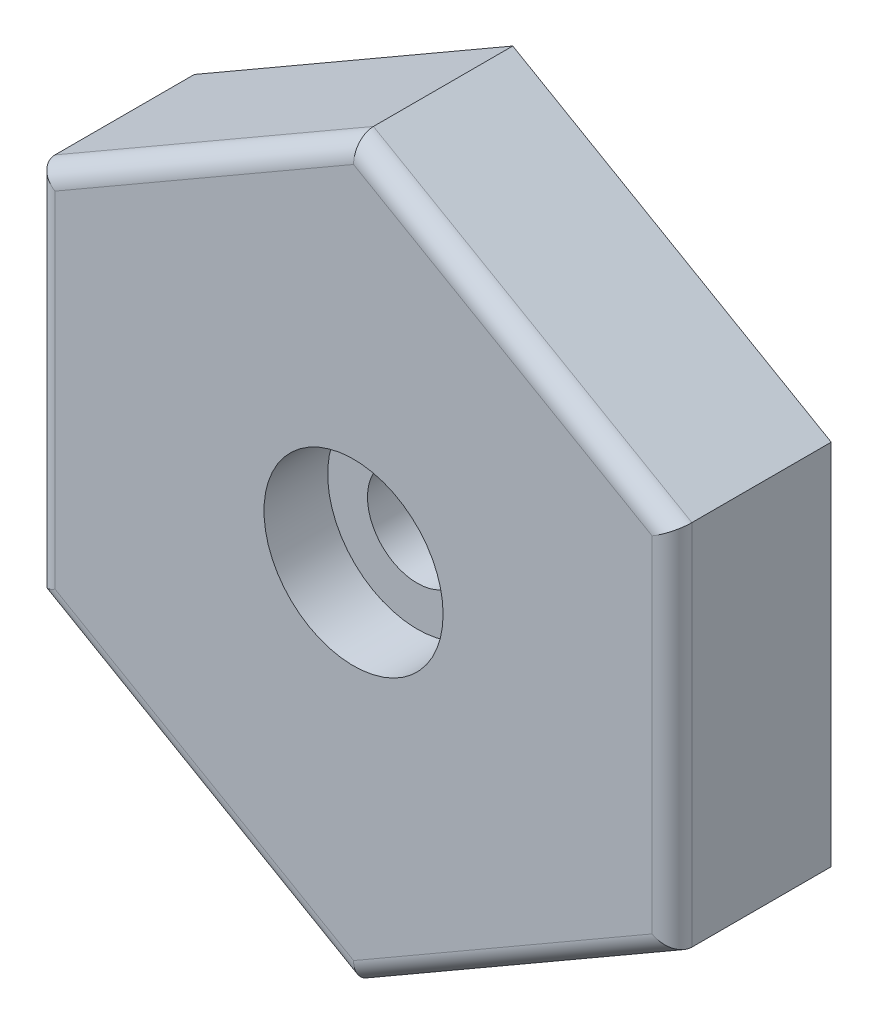
ISO-10303-21;
HEADER;
FILE_DESCRIPTION(('STEP AP214'),'2;1');
FILE_NAME('part.step','',(''),(''),'','','');
FILE_SCHEMA(('AUTOMOTIVE_DESIGN { 1 0 10303 214 1 1 1 1 }'));
ENDSEC;
DATA;
#1=APPLICATION_CONTEXT('core data for automotive mechanical design processes');
#2=APPLICATION_PROTOCOL_DEFINITION('international standard','automotive_design',2000,#1);
#3=PRODUCT_CONTEXT('',#1,'mechanical');
#4=PRODUCT('Part','Part','',(#3));
#5=PRODUCT_RELATED_PRODUCT_CATEGORY('part','',(#4));
#6=PRODUCT_DEFINITION_FORMATION('','',#4);
#7=PRODUCT_DEFINITION_CONTEXT('part definition',#1,'design');
#8=PRODUCT_DEFINITION('design','',#6,#7);
#9=PRODUCT_DEFINITION_SHAPE('','',#8);
#10=(LENGTH_UNIT() NAMED_UNIT(*) SI_UNIT(.MILLI.,.METRE.));
#11=(NAMED_UNIT(*) PLANE_ANGLE_UNIT() SI_UNIT($,.RADIAN.));
#12=(NAMED_UNIT(*) SI_UNIT($,.STERADIAN.) SOLID_ANGLE_UNIT());
#13=UNCERTAINTY_MEASURE_WITH_UNIT(LENGTH_MEASURE(1.E-05),#10,'distance_accuracy_value','');
#14=(GEOMETRIC_REPRESENTATION_CONTEXT(3) GLOBAL_UNCERTAINTY_ASSIGNED_CONTEXT((#13)) GLOBAL_UNIT_ASSIGNED_CONTEXT((#10,
#11,#12)) REPRESENTATION_CONTEXT('',''));
#15=CARTESIAN_POINT('',(0.,0.,0.));
#16=DIRECTION('',(0.,0.,1.));
#17=DIRECTION('',(1.,0.,0.));
#18=AXIS2_PLACEMENT_3D('',#15,#16,#17);
#19=CARTESIAN_POINT('',(0.,0.,8.));
#20=DIRECTION('',(0.,0.,-1.));
#21=DIRECTION('',(-1.,0.,0.));
#22=AXIS2_PLACEMENT_3D('',#19,#20,#21);
#23=CYLINDRICAL_SURFACE('',#22,2.5);
#24=CARTESIAN_POINT('',(0.,0.,4.8));
#25=DIRECTION('',(0.,0.,1.));
#26=DIRECTION('',(1.,0.,0.));
#27=AXIS2_PLACEMENT_3D('',#24,#25,#26);
#28=CIRCLE('',#27,2.5);
#29=CARTESIAN_POINT('',(2.5,0.,4.8));
#30=VERTEX_POINT('',#29);
#31=EDGE_CURVE('E231',#30,#30,#28,.T.);
#32=ORIENTED_EDGE('',*,*,#31,.T.);
#33=EDGE_LOOP('',(#32));
#34=FACE_BOUND('',#33,.T.);
#35=CARTESIAN_POINT('',(0.,0.,2.));
#36=DIRECTION('',(0.,0.,-1.));
#37=DIRECTION('',(-1.,0.,0.));
#38=AXIS2_PLACEMENT_3D('',#35,#36,#37);
#39=CIRCLE('',#38,2.5);
#40=CARTESIAN_POINT('',(-2.5,0.,2.));
#41=VERTEX_POINT('',#40);
#42=EDGE_CURVE('E318',#41,#41,#39,.T.);
#43=ORIENTED_EDGE('',*,*,#42,.T.);
#44=EDGE_LOOP('',(#43));
#45=FACE_BOUND('',#44,.T.);
#46=ADVANCED_FACE('F39',(#34,#45),#23,.F.);
#47=CARTESIAN_POINT('',(0.,0.,6.));
#48=DIRECTION('',(0.,0.,-1.));
#49=DIRECTION('',(-1.,0.,0.));
#50=AXIS2_PLACEMENT_3D('',#47,#48,#49);
#51=CYLINDRICAL_SURFACE('',#50,8.);
#52=CARTESIAN_POINT('',(0.,0.,6.));
#53=DIRECTION('',(0.,0.,-1.));
#54=DIRECTION('',(-1.,0.,0.));
#55=AXIS2_PLACEMENT_3D('',#52,#53,#54);
#56=CIRCLE('',#55,8.);
#57=CARTESIAN_POINT('',(-8.,0.,6.));
#58=VERTEX_POINT('',#57);
#59=EDGE_CURVE('E182',#58,#58,#56,.T.);
#60=ORIENTED_EDGE('',*,*,#59,.T.);
#61=EDGE_LOOP('',(#60));
#62=FACE_BOUND('',#61,.T.);
#63=CARTESIAN_POINT('',(0.,0.,2.));
#64=DIRECTION('',(0.,0.,-1.));
#65=DIRECTION('',(-1.,0.,0.));
#66=AXIS2_PLACEMENT_3D('',#63,#64,#65);
#67=CIRCLE('',#66,8.);
#68=CARTESIAN_POINT('',(-8.,0.,2.));
#69=VERTEX_POINT('',#68);
#70=EDGE_CURVE('E630',#69,#69,#67,.T.);
#71=ORIENTED_EDGE('',*,*,#70,.F.);
#72=EDGE_LOOP('',(#71));
#73=FACE_BOUND('',#72,.T.);
#74=ADVANCED_FACE('F344',(#62,#73),#51,.T.);
#75=CARTESIAN_POINT('',(0.,0.,8.));
#76=DIRECTION('',(0.,0.,1.));
#77=DIRECTION('',(1.,0.,0.));
#78=AXIS2_PLACEMENT_3D('',#75,#76,#77);
#79=PLANE('',#78);
#80=DIRECTION('',(-0.866025403784439,0.5,0.));
#81=VECTOR('',#80,1.);
#82=CARTESIAN_POINT('',(-0.500000000000005,17.6091832102836,8.));
#83=LINE('',#82,#81);
#84=CARTESIAN_POINT('',(15.,8.66025403784437,8.));
#85=VERTEX_POINT('',#84);
#86=CARTESIAN_POINT('',(0.,17.3205080756887,8.));
#87=VERTEX_POINT('',#86);
#88=EDGE_CURVE('E277',#85,#87,#83,.T.);
#89=ORIENTED_EDGE('',*,*,#88,.T.);
#90=DIRECTION('',(-0.866025403784439,-0.5,0.));
#91=VECTOR('',#90,1.);
#92=CARTESIAN_POINT('',(-15.5,8.37157890324957,8.));
#93=LINE('',#92,#91);
#94=CARTESIAN_POINT('',(-15.,8.66025403784438,8.));
#95=VERTEX_POINT('',#94);
#96=EDGE_CURVE('E295',#87,#95,#93,.T.);
#97=ORIENTED_EDGE('',*,*,#96,.T.);
#98=DIRECTION('',(0.,-1.,0.));
#99=VECTOR('',#98,1.);
#100=CARTESIAN_POINT('',(-15.,-9.23760430703399,8.));
#101=LINE('',#100,#99);
#102=CARTESIAN_POINT('',(-15.,-8.66025403784436,8.));
#103=VERTEX_POINT('',#102);
#104=EDGE_CURVE('E292',#95,#103,#101,.T.);
#105=ORIENTED_EDGE('',*,*,#104,.T.);
#106=DIRECTION('',(0.866025403784439,-0.5,0.));
#107=VECTOR('',#106,1.);
#108=CARTESIAN_POINT('',(0.500000000000035,-17.6091832102836,8.));
#109=LINE('',#108,#107);
#110=CARTESIAN_POINT('',(0.,-17.3205080756887,8.));
#111=VERTEX_POINT('',#110);
#112=EDGE_CURVE('E289',#103,#111,#109,.T.);
#113=ORIENTED_EDGE('',*,*,#112,.T.);
#114=DIRECTION('',(0.866025403784439,0.5,0.));
#115=VECTOR('',#114,1.);
#116=CARTESIAN_POINT('',(15.5,-8.37157890324957,8.));
#117=LINE('',#116,#115);
#118=CARTESIAN_POINT('',(15.,-8.66025403784439,8.));
#119=VERTEX_POINT('',#118);
#120=EDGE_CURVE('E286',#111,#119,#117,.T.);
#121=ORIENTED_EDGE('',*,*,#120,.T.);
#122=DIRECTION('',(0.,1.,0.));
#123=VECTOR('',#122,1.);
#124=CARTESIAN_POINT('',(15.,9.23760430703399,8.));
#125=LINE('',#124,#123);
#126=EDGE_CURVE('E283',#119,#85,#125,.T.);
#127=ORIENTED_EDGE('',*,*,#126,.T.);
#128=EDGE_LOOP('',(#89,#97,#105,#113,#121,#127));
#129=FACE_BOUND('',#128,.T.);
#130=CARTESIAN_POINT('',(0.,0.,8.));
#131=DIRECTION('',(0.,0.,1.));
#132=DIRECTION('',(1.,0.,0.));
#133=AXIS2_PLACEMENT_3D('',#130,#131,#132);
#134=CIRCLE('',#133,4.5);
#135=CARTESIAN_POINT('',(4.5,0.,8.));
#136=VERTEX_POINT('',#135);
#137=EDGE_CURVE('E215',#136,#136,#134,.T.);
#138=ORIENTED_EDGE('',*,*,#137,.F.);
#139=EDGE_LOOP('',(#138));
#140=FACE_BOUND('',#139,.T.);
#141=ADVANCED_FACE('F365',(#129,#140),#79,.T.);
#142=CARTESIAN_POINT('',(0.,0.,0.));
#143=DIRECTION('',(0.,0.,1.));
#144=DIRECTION('',(1.,0.,0.));
#145=AXIS2_PLACEMENT_3D('',#142,#143,#144);
#146=PLANE('',#145);
#147=DIRECTION('',(0.5,0.866025403784439,0.));
#148=VECTOR('',#147,1.);
#149=CARTESIAN_POINT('',(-13.971876514389,0.,0.));
#150=LINE('',#149,#148);
#151=CARTESIAN_POINT('',(-13.971876514389,0.,0.));
#152=VERTEX_POINT('',#151);
#153=CARTESIAN_POINT('',(-6.98593825719448,12.1,0.));
#154=VERTEX_POINT('',#153);
#155=EDGE_CURVE('E198',#152,#154,#150,.T.);
#156=ORIENTED_EDGE('',*,*,#155,.F.);
#157=DIRECTION('',(-0.5,0.866025403784439,0.));
#158=VECTOR('',#157,1.);
#159=CARTESIAN_POINT('',(-6.98593825719447,-12.1,0.));
#160=LINE('',#159,#158);
#161=CARTESIAN_POINT('',(-6.98593825719447,-12.1,0.));
#162=VERTEX_POINT('',#161);
#163=EDGE_CURVE('E154',#162,#152,#160,.T.);
#164=ORIENTED_EDGE('',*,*,#163,.F.);
#165=DIRECTION('',(-1.,0.,0.));
#166=VECTOR('',#165,1.);
#167=CARTESIAN_POINT('',(6.98593825719447,-12.1,0.));
#168=LINE('',#167,#166);
#169=CARTESIAN_POINT('',(6.98593825719447,-12.1,0.));
#170=VERTEX_POINT('',#169);
#171=EDGE_CURVE('E175',#170,#162,#168,.T.);
#172=ORIENTED_EDGE('',*,*,#171,.F.);
#173=DIRECTION('',(-0.5,-0.866025403784439,0.));
#174=VECTOR('',#173,1.);
#175=CARTESIAN_POINT('',(13.971876514389,0.,0.));
#176=LINE('',#175,#174);
#177=CARTESIAN_POINT('',(13.971876514389,0.,0.));
#178=VERTEX_POINT('',#177);
#179=EDGE_CURVE('E179',#178,#170,#176,.T.);
#180=ORIENTED_EDGE('',*,*,#179,.F.);
#181=DIRECTION('',(0.5,-0.866025403784439,0.));
#182=VECTOR('',#181,1.);
#183=CARTESIAN_POINT('',(6.98593825719448,12.1,0.));
#184=LINE('',#183,#182);
#185=CARTESIAN_POINT('',(6.98593825719448,12.1,0.));
#186=VERTEX_POINT('',#185);
#187=EDGE_CURVE('E205',#186,#178,#184,.T.);
#188=ORIENTED_EDGE('',*,*,#187,.F.);
#189=DIRECTION('',(1.,0.,0.));
#190=VECTOR('',#189,1.);
#191=CARTESIAN_POINT('',(-6.98593825719448,12.1,0.));
#192=LINE('',#191,#190);
#193=EDGE_CURVE('E201',#154,#186,#192,.T.);
#194=ORIENTED_EDGE('',*,*,#193,.F.);
#195=EDGE_LOOP('',(#156,#164,#172,#180,#188,#194));
#196=FACE_BOUND('',#195,.T.);
#197=DIRECTION('',(0.,1.,0.));
#198=VECTOR('',#197,1.);
#199=CARTESIAN_POINT('',(16.,-9.23760430703401,0.));
#200=LINE('',#199,#198);
#201=CARTESIAN_POINT('',(16.,-9.23760430703401,0.));
#202=VERTEX_POINT('',#201);
#203=CARTESIAN_POINT('',(16.,9.23760430703399,0.));
#204=VERTEX_POINT('',#203);
#205=EDGE_CURVE('E235',#202,#204,#200,.T.);
#206=ORIENTED_EDGE('',*,*,#205,.F.);
#207=DIRECTION('',(0.866025403784439,0.5,0.));
#208=VECTOR('',#207,1.);
#209=CARTESIAN_POINT('',(0.,-18.475208614068,0.));
#210=LINE('',#209,#208);
#211=CARTESIAN_POINT('',(0.,-18.475208614068,0.));
#212=VERTEX_POINT('',#211);
#213=EDGE_CURVE('E255',#212,#202,#210,.T.);
#214=ORIENTED_EDGE('',*,*,#213,.F.);
#215=DIRECTION('',(0.866025403784439,-0.5,0.));
#216=VECTOR('',#215,1.);
#217=CARTESIAN_POINT('',(-16.,-9.23760430703399,0.));
#218=LINE('',#217,#216);
#219=CARTESIAN_POINT('',(-16.,-9.23760430703399,0.));
#220=VERTEX_POINT('',#219);
#221=EDGE_CURVE('E251',#220,#212,#218,.T.);
#222=ORIENTED_EDGE('',*,*,#221,.F.);
#223=DIRECTION('',(0.,-1.,0.));
#224=VECTOR('',#223,1.);
#225=CARTESIAN_POINT('',(-16.,9.23760430703401,0.));
#226=LINE('',#225,#224);
#227=CARTESIAN_POINT('',(-16.,9.23760430703401,0.));
#228=VERTEX_POINT('',#227);
#229=EDGE_CURVE('E247',#228,#220,#226,.T.);
#230=ORIENTED_EDGE('',*,*,#229,.F.);
#231=DIRECTION('',(-0.866025403784439,-0.5,0.));
#232=VECTOR('',#231,1.);
#233=CARTESIAN_POINT('',(0.,18.475208614068,0.));
#234=LINE('',#233,#232);
#235=CARTESIAN_POINT('',(0.,18.475208614068,0.));
#236=VERTEX_POINT('',#235);
#237=EDGE_CURVE('E243',#236,#228,#234,.T.);
#238=ORIENTED_EDGE('',*,*,#237,.F.);
#239=DIRECTION('',(-0.866025403784438,0.5,0.));
#240=VECTOR('',#239,1.);
#241=CARTESIAN_POINT('',(16.,9.23760430703399,0.));
#242=LINE('',#241,#240);
#243=EDGE_CURVE('E239',#204,#236,#242,.T.);
#244=ORIENTED_EDGE('',*,*,#243,.F.);
#245=EDGE_LOOP('',(#206,#214,#222,#230,#238,#244));
#246=FACE_BOUND('',#245,.T.);
#247=ADVANCED_FACE('F373',(#196,#246),#146,.F.);
#248=CARTESIAN_POINT('',(16.,-9.23760430703401,8.));
#249=DIRECTION('',(-1.,0.,0.));
#250=DIRECTION('',(0.,-1.,0.));
#251=AXIS2_PLACEMENT_3D('',#248,#249,#250);
#252=PLANE('',#251);
#253=DIRECTION('',(0.,0.,-1.));
#254=VECTOR('',#253,1.);
#255=CARTESIAN_POINT('',(16.,9.23760430703399,8.));
#256=LINE('',#255,#254);
#257=CARTESIAN_POINT('',(16.,9.23760430703399,7.));
#258=VERTEX_POINT('',#257);
#259=EDGE_CURVE('E274',#258,#204,#256,.T.);
#260=ORIENTED_EDGE('',*,*,#259,.F.);
#261=DIRECTION('',(0.,1.,0.));
#262=VECTOR('',#261,1.);
#263=CARTESIAN_POINT('',(16.,-9.23760430703401,7.));
#264=LINE('',#263,#262);
#265=CARTESIAN_POINT('',(16.,-9.23760430703401,7.));
#266=VERTEX_POINT('',#265);
#267=EDGE_CURVE('E49',#258,#266,#264,.F.);
#268=ORIENTED_EDGE('',*,*,#267,.T.);
#269=DIRECTION('',(0.,0.,-1.));
#270=VECTOR('',#269,1.);
#271=CARTESIAN_POINT('',(16.,-9.23760430703401,8.));
#272=LINE('',#271,#270);
#273=EDGE_CURVE('E259',#266,#202,#272,.T.);
#274=ORIENTED_EDGE('',*,*,#273,.T.);
#275=ORIENTED_EDGE('',*,*,#205,.T.);
#276=EDGE_LOOP('',(#260,#268,#274,#275));
#277=FACE_BOUND('',#276,.T.);
#278=ADVANCED_FACE('F377',(#277),#252,.F.);
#279=CARTESIAN_POINT('',(16.,9.23760430703399,8.));
#280=DIRECTION('',(-0.5,-0.866025403784438,0.));
#281=DIRECTION('',(0.866025403784439,-0.5,0.));
#282=AXIS2_PLACEMENT_3D('',#279,#280,#281);
#283=PLANE('',#282);
#284=DIRECTION('',(0.,0.,-1.));
#285=VECTOR('',#284,1.);
#286=CARTESIAN_POINT('',(0.,18.475208614068,8.));
#287=LINE('',#286,#285);
#288=CARTESIAN_POINT('',(0.,18.475208614068,7.));
#289=VERTEX_POINT('',#288);
#290=EDGE_CURVE('E271',#289,#236,#287,.T.);
#291=ORIENTED_EDGE('',*,*,#290,.F.);
#292=DIRECTION('',(-0.866025403784439,0.5,0.));
#293=VECTOR('',#292,1.);
#294=CARTESIAN_POINT('',(16.,9.23760430703399,7.));
#295=LINE('',#294,#293);
#296=EDGE_CURVE('E11',#289,#258,#295,.F.);
#297=ORIENTED_EDGE('',*,*,#296,.T.);
#298=ORIENTED_EDGE('',*,*,#259,.T.);
#299=ORIENTED_EDGE('',*,*,#243,.T.);
#300=EDGE_LOOP('',(#291,#297,#298,#299));
#301=FACE_BOUND('',#300,.T.);
#302=ADVANCED_FACE('F394',(#301),#283,.F.);
#303=CARTESIAN_POINT('',(0.,18.475208614068,8.));
#304=DIRECTION('',(0.5,-0.866025403784439,0.));
#305=DIRECTION('',(0.866025403784439,0.5,0.));
#306=AXIS2_PLACEMENT_3D('',#303,#304,#305);
#307=PLANE('',#306);
#308=DIRECTION('',(0.,0.,-1.));
#309=VECTOR('',#308,1.);
#310=CARTESIAN_POINT('',(-16.,9.23760430703401,8.));
#311=LINE('',#310,#309);
#312=CARTESIAN_POINT('',(-16.,9.23760430703401,7.));
#313=VERTEX_POINT('',#312);
#314=EDGE_CURVE('E268',#313,#228,#311,.T.);
#315=ORIENTED_EDGE('',*,*,#314,.F.);
#316=DIRECTION('',(-0.866025403784439,-0.5,0.));
#317=VECTOR('',#316,1.);
#318=CARTESIAN_POINT('',(0.,18.475208614068,7.));
#319=LINE('',#318,#317);
#320=EDGE_CURVE('E299',#313,#289,#319,.F.);
#321=ORIENTED_EDGE('',*,*,#320,.T.);
#322=ORIENTED_EDGE('',*,*,#290,.T.);
#323=ORIENTED_EDGE('',*,*,#237,.T.);
#324=EDGE_LOOP('',(#315,#321,#322,#323));
#325=FACE_BOUND('',#324,.T.);
#326=ADVANCED_FACE('F390',(#325),#307,.F.);
#327=CARTESIAN_POINT('',(-16.,9.23760430703401,8.));
#328=DIRECTION('',(1.,0.,0.));
#329=DIRECTION('',(0.,1.,0.));
#330=AXIS2_PLACEMENT_3D('',#327,#328,#329);
#331=PLANE('',#330);
#332=DIRECTION('',(0.,0.,-1.));
#333=VECTOR('',#332,1.);
#334=CARTESIAN_POINT('',(-16.,-9.23760430703399,8.));
#335=LINE('',#334,#333);
#336=CARTESIAN_POINT('',(-16.,-9.23760430703399,7.));
#337=VERTEX_POINT('',#336);
#338=EDGE_CURVE('E265',#337,#220,#335,.T.);
#339=ORIENTED_EDGE('',*,*,#338,.F.);
#340=DIRECTION('',(0.,-1.,0.));
#341=VECTOR('',#340,1.);
#342=CARTESIAN_POINT('',(-16.,9.23760430703401,7.));
#343=LINE('',#342,#341);
#344=EDGE_CURVE('E303',#337,#313,#343,.F.);
#345=ORIENTED_EDGE('',*,*,#344,.T.);
#346=ORIENTED_EDGE('',*,*,#314,.T.);
#347=ORIENTED_EDGE('',*,*,#229,.T.);
#348=EDGE_LOOP('',(#339,#345,#346,#347));
#349=FACE_BOUND('',#348,.T.);
#350=ADVANCED_FACE('F386',(#349),#331,.F.);
#351=CARTESIAN_POINT('',(-16.,-9.23760430703399,8.));
#352=DIRECTION('',(0.5,0.866025403784439,0.));
#353=DIRECTION('',(-0.866025403784439,0.5,0.));
#354=AXIS2_PLACEMENT_3D('',#351,#352,#353);
#355=PLANE('',#354);
#356=DIRECTION('',(0.,0.,-1.));
#357=VECTOR('',#356,1.);
#358=CARTESIAN_POINT('',(0.,-18.475208614068,8.));
#359=LINE('',#358,#357);
#360=CARTESIAN_POINT('',(0.,-18.475208614068,7.));
#361=VERTEX_POINT('',#360);
#362=EDGE_CURVE('E262',#361,#212,#359,.T.);
#363=ORIENTED_EDGE('',*,*,#362,.F.);
#364=DIRECTION('',(0.866025403784439,-0.5,0.));
#365=VECTOR('',#364,1.);
#366=CARTESIAN_POINT('',(-16.,-9.23760430703399,7.));
#367=LINE('',#366,#365);
#368=EDGE_CURVE('E306',#361,#337,#367,.F.);
#369=ORIENTED_EDGE('',*,*,#368,.T.);
#370=ORIENTED_EDGE('',*,*,#338,.T.);
#371=ORIENTED_EDGE('',*,*,#221,.T.);
#372=EDGE_LOOP('',(#363,#369,#370,#371));
#373=FACE_BOUND('',#372,.T.);
#374=ADVANCED_FACE('F382',(#373),#355,.F.);
#375=CARTESIAN_POINT('',(0.,-18.475208614068,8.));
#376=DIRECTION('',(-0.5,0.866025403784439,0.));
#377=DIRECTION('',(-0.866025403784439,-0.5,0.));
#378=AXIS2_PLACEMENT_3D('',#375,#376,#377);
#379=PLANE('',#378);
#380=ORIENTED_EDGE('',*,*,#273,.F.);
#381=DIRECTION('',(0.866025403784439,0.5,0.));
#382=VECTOR('',#381,1.);
#383=CARTESIAN_POINT('',(0.,-18.475208614068,7.));
#384=LINE('',#383,#382);
#385=EDGE_CURVE('E309',#266,#361,#384,.F.);
#386=ORIENTED_EDGE('',*,*,#385,.T.);
#387=ORIENTED_EDGE('',*,*,#362,.T.);
#388=ORIENTED_EDGE('',*,*,#213,.T.);
#389=EDGE_LOOP('',(#380,#386,#387,#388));
#390=FACE_BOUND('',#389,.T.);
#391=ADVANCED_FACE('F379',(#390),#379,.F.);
#392=CARTESIAN_POINT('',(0.,0.,4.8));
#393=DIRECTION('',(0.,0.,1.));
#394=DIRECTION('',(1.,0.,0.));
#395=AXIS2_PLACEMENT_3D('',#392,#393,#394);
#396=CYLINDRICAL_SURFACE('',#395,4.5);
#397=CARTESIAN_POINT('',(0.,0.,4.8));
#398=DIRECTION('',(0.,0.,1.));
#399=DIRECTION('',(1.,0.,0.));
#400=AXIS2_PLACEMENT_3D('',#397,#398,#399);
#401=CIRCLE('',#400,4.5);
#402=CARTESIAN_POINT('',(4.5,0.,4.8));
#403=VERTEX_POINT('',#402);
#404=EDGE_CURVE('E227',#403,#403,#401,.T.);
#405=ORIENTED_EDGE('',*,*,#404,.F.);
#406=EDGE_LOOP('',(#405));
#407=FACE_BOUND('',#406,.T.);
#408=ORIENTED_EDGE('',*,*,#137,.T.);
#409=EDGE_LOOP('',(#408));
#410=FACE_BOUND('',#409,.T.);
#411=ADVANCED_FACE('F369',(#407,#410),#396,.F.);
#412=CARTESIAN_POINT('',(0.,0.,4.8));
#413=DIRECTION('',(0.,0.,1.));
#414=DIRECTION('',(1.,0.,0.));
#415=AXIS2_PLACEMENT_3D('',#412,#413,#414);
#416=PLANE('',#415);
#417=ORIENTED_EDGE('',*,*,#31,.F.);
#418=EDGE_LOOP('',(#417));
#419=FACE_BOUND('',#418,.T.);
#420=ORIENTED_EDGE('',*,*,#404,.T.);
#421=EDGE_LOOP('',(#420));
#422=FACE_BOUND('',#421,.T.);
#423=ADVANCED_FACE('F495',(#419,#422),#416,.T.);
#424=CARTESIAN_POINT('',(-6.98593825719447,-12.1,6.));
#425=DIRECTION('',(-0.866025403784439,-0.5,0.));
#426=DIRECTION('',(0.5,-0.866025403784439,0.));
#427=AXIS2_PLACEMENT_3D('',#424,#425,#426);
#428=PLANE('',#427);
#429=ORIENTED_EDGE('',*,*,#163,.T.);
#430=DIRECTION('',(0.,0.,-1.));
#431=VECTOR('',#430,1.);
#432=CARTESIAN_POINT('',(-13.971876514389,0.,6.));
#433=LINE('',#432,#431);
#434=CARTESIAN_POINT('',(-13.971876514389,0.,6.));
#435=VERTEX_POINT('',#434);
#436=EDGE_CURVE('E147',#435,#152,#433,.T.);
#437=ORIENTED_EDGE('',*,*,#436,.F.);
#438=DIRECTION('',(-0.5,0.866025403784439,0.));
#439=VECTOR('',#438,1.);
#440=CARTESIAN_POINT('',(-6.98593825719447,-12.1,6.));
#441=LINE('',#440,#439);
#442=CARTESIAN_POINT('',(-6.98593825719447,-12.1,6.));
#443=VERTEX_POINT('',#442);
#444=EDGE_CURVE('E151',#443,#435,#441,.T.);
#445=ORIENTED_EDGE('',*,*,#444,.F.);
#446=DIRECTION('',(0.,0.,-1.));
#447=VECTOR('',#446,1.);
#448=CARTESIAN_POINT('',(-6.98593825719447,-12.1,6.));
#449=LINE('',#448,#447);
#450=EDGE_CURVE('E212',#443,#162,#449,.T.);
#451=ORIENTED_EDGE('',*,*,#450,.T.);
#452=EDGE_LOOP('',(#429,#437,#445,#451));
#453=FACE_BOUND('',#452,.T.);
#454=ADVANCED_FACE('F149',(#453),#428,.F.);
#455=CARTESIAN_POINT('',(6.98593825719447,-12.1,6.));
#456=DIRECTION('',(0.,-1.,0.));
#457=DIRECTION('',(0.,0.,-1.));
#458=AXIS2_PLACEMENT_3D('',#455,#456,#457);
#459=PLANE('',#458);
#460=ORIENTED_EDGE('',*,*,#171,.T.);
#461=ORIENTED_EDGE('',*,*,#450,.F.);
#462=DIRECTION('',(-1.,0.,0.));
#463=VECTOR('',#462,1.);
#464=CARTESIAN_POINT('',(6.98593825719447,-12.1,6.));
#465=LINE('',#464,#463);
#466=CARTESIAN_POINT('',(6.98593825719447,-12.1,6.));
#467=VERTEX_POINT('',#466);
#468=EDGE_CURVE('E160',#467,#443,#465,.T.);
#469=ORIENTED_EDGE('',*,*,#468,.F.);
#470=DIRECTION('',(0.,0.,-1.));
#471=VECTOR('',#470,1.);
#472=CARTESIAN_POINT('',(6.98593825719447,-12.1,6.));
#473=LINE('',#472,#471);
#474=EDGE_CURVE('E216',#467,#170,#473,.T.);
#475=ORIENTED_EDGE('',*,*,#474,.T.);
#476=EDGE_LOOP('',(#460,#461,#469,#475));
#477=FACE_BOUND('',#476,.T.);
#478=ADVANCED_FACE('F506',(#477),#459,.F.);
#479=CARTESIAN_POINT('',(13.971876514389,0.,6.));
#480=DIRECTION('',(0.866025403784438,-0.5,0.));
#481=DIRECTION('',(0.5,0.866025403784439,0.));
#482=AXIS2_PLACEMENT_3D('',#479,#480,#481);
#483=PLANE('',#482);
#484=ORIENTED_EDGE('',*,*,#179,.T.);
#485=ORIENTED_EDGE('',*,*,#474,.F.);
#486=DIRECTION('',(-0.5,-0.866025403784439,0.));
#487=VECTOR('',#486,1.);
#488=CARTESIAN_POINT('',(13.971876514389,0.,6.));
#489=LINE('',#488,#487);
#490=CARTESIAN_POINT('',(13.971876514389,0.,6.));
#491=VERTEX_POINT('',#490);
#492=EDGE_CURVE('E191',#491,#467,#489,.T.);
#493=ORIENTED_EDGE('',*,*,#492,.F.);
#494=DIRECTION('',(0.,0.,-1.));
#495=VECTOR('',#494,1.);
#496=CARTESIAN_POINT('',(13.971876514389,0.,6.));
#497=LINE('',#496,#495);
#498=EDGE_CURVE('E219',#491,#178,#497,.T.);
#499=ORIENTED_EDGE('',*,*,#498,.T.);
#500=EDGE_LOOP('',(#484,#485,#493,#499));
#501=FACE_BOUND('',#500,.T.);
#502=ADVANCED_FACE('F513',(#501),#483,.F.);
#503=CARTESIAN_POINT('',(6.98593825719448,12.1,6.));
#504=DIRECTION('',(0.866025403784439,0.5,0.));
#505=DIRECTION('',(-0.5,0.866025403784439,0.));
#506=AXIS2_PLACEMENT_3D('',#503,#504,#505);
#507=PLANE('',#506);
#508=ORIENTED_EDGE('',*,*,#187,.T.);
#509=ORIENTED_EDGE('',*,*,#498,.F.);
#510=DIRECTION('',(0.5,-0.866025403784439,0.));
#511=VECTOR('',#510,1.);
#512=CARTESIAN_POINT('',(6.98593825719448,12.1,6.));
#513=LINE('',#512,#511);
#514=CARTESIAN_POINT('',(6.98593825719448,12.1,6.));
#515=VERTEX_POINT('',#514);
#516=EDGE_CURVE('E187',#515,#491,#513,.T.);
#517=ORIENTED_EDGE('',*,*,#516,.F.);
#518=DIRECTION('',(0.,0.,-1.));
#519=VECTOR('',#518,1.);
#520=CARTESIAN_POINT('',(6.98593825719448,12.1,6.));
#521=LINE('',#520,#519);
#522=EDGE_CURVE('E222',#515,#186,#521,.T.);
#523=ORIENTED_EDGE('',*,*,#522,.T.);
#524=EDGE_LOOP('',(#508,#509,#517,#523));
#525=FACE_BOUND('',#524,.T.);
#526=ADVANCED_FACE('F520',(#525),#507,.F.);
#527=CARTESIAN_POINT('',(-6.98593825719448,12.1,6.));
#528=DIRECTION('',(0.,1.,0.));
#529=DIRECTION('',(-1.,0.,0.));
#530=AXIS2_PLACEMENT_3D('',#527,#528,#529);
#531=PLANE('',#530);
#532=ORIENTED_EDGE('',*,*,#193,.T.);
#533=ORIENTED_EDGE('',*,*,#522,.F.);
#534=DIRECTION('',(1.,0.,0.));
#535=VECTOR('',#534,1.);
#536=CARTESIAN_POINT('',(-6.98593825719448,12.1,6.));
#537=LINE('',#536,#535);
#538=CARTESIAN_POINT('',(-6.98593825719448,12.1,6.));
#539=VERTEX_POINT('',#538);
#540=EDGE_CURVE('E169',#539,#515,#537,.T.);
#541=ORIENTED_EDGE('',*,*,#540,.F.);
#542=DIRECTION('',(0.,0.,-1.));
#543=VECTOR('',#542,1.);
#544=CARTESIAN_POINT('',(-6.98593825719448,12.1,6.));
#545=LINE('',#544,#543);
#546=EDGE_CURVE('E159',#539,#154,#545,.T.);
#547=ORIENTED_EDGE('',*,*,#546,.T.);
#548=EDGE_LOOP('',(#532,#533,#541,#547));
#549=FACE_BOUND('',#548,.T.);
#550=ADVANCED_FACE('F355',(#549),#531,.F.);
#551=CARTESIAN_POINT('',(-13.971876514389,0.,6.));
#552=DIRECTION('',(-0.866025403784439,0.5,0.));
#553=DIRECTION('',(-0.5,-0.866025403784439,0.));
#554=AXIS2_PLACEMENT_3D('',#551,#552,#553);
#555=PLANE('',#554);
#556=ORIENTED_EDGE('',*,*,#155,.T.);
#557=ORIENTED_EDGE('',*,*,#546,.F.);
#558=DIRECTION('',(0.5,0.866025403784439,0.));
#559=VECTOR('',#558,1.);
#560=CARTESIAN_POINT('',(-13.971876514389,0.,6.));
#561=LINE('',#560,#559);
#562=EDGE_CURVE('E163',#435,#539,#561,.T.);
#563=ORIENTED_EDGE('',*,*,#562,.F.);
#564=ORIENTED_EDGE('',*,*,#436,.T.);
#565=EDGE_LOOP('',(#556,#557,#563,#564));
#566=FACE_BOUND('',#565,.T.);
#567=ADVANCED_FACE('F164',(#566),#555,.F.);
#568=CARTESIAN_POINT('',(0.,0.,6.));
#569=DIRECTION('',(0.,0.,-1.));
#570=DIRECTION('',(-1.,0.,0.));
#571=AXIS2_PLACEMENT_3D('',#568,#569,#570);
#572=PLANE('',#571);
#573=ORIENTED_EDGE('',*,*,#59,.F.);
#574=EDGE_LOOP('',(#573));
#575=FACE_BOUND('',#574,.T.);
#576=ORIENTED_EDGE('',*,*,#444,.T.);
#577=ORIENTED_EDGE('',*,*,#562,.T.);
#578=ORIENTED_EDGE('',*,*,#540,.T.);
#579=ORIENTED_EDGE('',*,*,#516,.T.);
#580=ORIENTED_EDGE('',*,*,#492,.T.);
#581=ORIENTED_EDGE('',*,*,#468,.T.);
#582=EDGE_LOOP('',(#576,#577,#578,#579,#580,#581));
#583=FACE_BOUND('',#582,.T.);
#584=ADVANCED_FACE('F171',(#575,#583),#572,.T.);
#585=CARTESIAN_POINT('',(7.49999999999999,-12.9903810567666,7.));
#586=DIRECTION('',(-0.866025403784439,-0.5,0.));
#587=DIRECTION('',(0.5,-0.866025403784439,0.));
#588=AXIS2_PLACEMENT_3D('',#585,#586,#587);
#589=CYLINDRICAL_SURFACE('',#588,1.);
#590=CARTESIAN_POINT('',(0.,-17.3205080756887,7.));
#591=DIRECTION('',(-1.,0.,0.));
#592=DIRECTION('',(0.,-1.,0.));
#593=AXIS2_PLACEMENT_3D('',#590,#591,#592);
#594=ELLIPSE('',#593,1.15470053837925,1.);
#595=EDGE_CURVE('E328',#361,#111,#594,.T.);
#596=ORIENTED_EDGE('',*,*,#595,.F.);
#597=ORIENTED_EDGE('',*,*,#385,.F.);
#598=CARTESIAN_POINT('',(15.,-8.66025403784438,7.));
#599=DIRECTION('',(-0.5,-0.866025403784439,0.));
#600=DIRECTION('',(0.866025403784439,-0.5,0.));
#601=AXIS2_PLACEMENT_3D('',#598,#599,#600);
#602=ELLIPSE('',#601,1.15470053837925,1.);
#603=EDGE_CURVE('E43',#119,#266,#602,.F.);
#604=ORIENTED_EDGE('',*,*,#603,.F.);
#605=ORIENTED_EDGE('',*,*,#120,.F.);
#606=EDGE_LOOP('',(#596,#597,#604,#605));
#607=FACE_BOUND('',#606,.T.);
#608=ADVANCED_FACE('F41',(#607),#589,.T.);
#609=CARTESIAN_POINT('',(15.,0.,7.));
#610=DIRECTION('',(0.,-1.,0.));
#611=DIRECTION('',(1.,0.,0.));
#612=AXIS2_PLACEMENT_3D('',#609,#610,#611);
#613=CYLINDRICAL_SURFACE('',#612,1.);
#614=ORIENTED_EDGE('',*,*,#603,.T.);
#615=ORIENTED_EDGE('',*,*,#267,.F.);
#616=CARTESIAN_POINT('',(15.,8.66025403784436,7.));
#617=DIRECTION('',(0.5,-0.866025403784439,0.));
#618=DIRECTION('',(0.866025403784439,0.5,0.));
#619=AXIS2_PLACEMENT_3D('',#616,#617,#618);
#620=ELLIPSE('',#619,1.15470053837925,1.);
#621=EDGE_CURVE('E325',#85,#258,#620,.F.);
#622=ORIENTED_EDGE('',*,*,#621,.F.);
#623=ORIENTED_EDGE('',*,*,#126,.F.);
#624=EDGE_LOOP('',(#614,#615,#622,#623));
#625=FACE_BOUND('',#624,.T.);
#626=ADVANCED_FACE('F353',(#625),#613,.T.);
#627=CARTESIAN_POINT('',(-7.49999999999997,-12.9903810567665,7.));
#628=DIRECTION('',(-0.866025403784439,0.5,0.));
#629=DIRECTION('',(-0.5,-0.866025403784439,0.));
#630=AXIS2_PLACEMENT_3D('',#627,#628,#629);
#631=CYLINDRICAL_SURFACE('',#630,1.);
#632=ORIENTED_EDGE('',*,*,#595,.T.);
#633=ORIENTED_EDGE('',*,*,#112,.F.);
#634=CARTESIAN_POINT('',(-15.,-8.66025403784436,7.));
#635=DIRECTION('',(-0.5,0.866025403784438,0.));
#636=DIRECTION('',(-0.866025403784439,-0.5,0.));
#637=AXIS2_PLACEMENT_3D('',#634,#635,#636);
#638=ELLIPSE('',#637,1.15470053837925,1.);
#639=EDGE_CURVE('E321',#337,#103,#638,.T.);
#640=ORIENTED_EDGE('',*,*,#639,.F.);
#641=ORIENTED_EDGE('',*,*,#368,.F.);
#642=EDGE_LOOP('',(#632,#633,#640,#641));
#643=FACE_BOUND('',#642,.T.);
#644=ADVANCED_FACE('F412',(#643),#631,.T.);
#645=CARTESIAN_POINT('',(7.49999999999999,12.9903810567666,7.));
#646=DIRECTION('',(0.866025403784439,-0.5,0.));
#647=DIRECTION('',(0.5,0.866025403784438,0.));
#648=AXIS2_PLACEMENT_3D('',#645,#646,#647);
#649=CYLINDRICAL_SURFACE('',#648,1.);
#650=ORIENTED_EDGE('',*,*,#621,.T.);
#651=ORIENTED_EDGE('',*,*,#296,.F.);
#652=CARTESIAN_POINT('',(0.,17.3205080756887,7.));
#653=DIRECTION('',(1.,0.,0.));
#654=DIRECTION('',(0.,-1.,0.));
#655=AXIS2_PLACEMENT_3D('',#652,#653,#654);
#656=ELLIPSE('',#655,1.15470053837925,1.);
#657=EDGE_CURVE('E317',#87,#289,#656,.F.);
#658=ORIENTED_EDGE('',*,*,#657,.F.);
#659=ORIENTED_EDGE('',*,*,#88,.F.);
#660=EDGE_LOOP('',(#650,#651,#658,#659));
#661=FACE_BOUND('',#660,.T.);
#662=ADVANCED_FACE('F408',(#661),#649,.T.);
#663=CARTESIAN_POINT('',(-15.,0.,7.));
#664=DIRECTION('',(0.,1.,0.));
#665=DIRECTION('',(-1.,0.,0.));
#666=AXIS2_PLACEMENT_3D('',#663,#664,#665);
#667=CYLINDRICAL_SURFACE('',#666,1.);
#668=ORIENTED_EDGE('',*,*,#639,.T.);
#669=ORIENTED_EDGE('',*,*,#104,.F.);
#670=CARTESIAN_POINT('',(-15.,8.66025403784438,7.));
#671=DIRECTION('',(0.5,0.866025403784439,0.));
#672=DIRECTION('',(-0.866025403784439,0.5,0.));
#673=AXIS2_PLACEMENT_3D('',#670,#671,#672);
#674=ELLIPSE('',#673,1.15470053837925,1.);
#675=EDGE_CURVE('E314',#313,#95,#674,.T.);
#676=ORIENTED_EDGE('',*,*,#675,.F.);
#677=ORIENTED_EDGE('',*,*,#344,.F.);
#678=EDGE_LOOP('',(#668,#669,#676,#677));
#679=FACE_BOUND('',#678,.T.);
#680=ADVANCED_FACE('F404',(#679),#667,.T.);
#681=CARTESIAN_POINT('',(-7.49999999999998,12.9903810567666,7.));
#682=DIRECTION('',(0.866025403784439,0.5,0.));
#683=DIRECTION('',(-0.5,0.866025403784439,0.));
#684=AXIS2_PLACEMENT_3D('',#681,#682,#683);
#685=CYLINDRICAL_SURFACE('',#684,1.);
#686=ORIENTED_EDGE('',*,*,#657,.T.);
#687=ORIENTED_EDGE('',*,*,#320,.F.);
#688=ORIENTED_EDGE('',*,*,#675,.T.);
#689=ORIENTED_EDGE('',*,*,#96,.F.);
#690=EDGE_LOOP('',(#686,#687,#688,#689));
#691=FACE_BOUND('',#690,.T.);
#692=ADVANCED_FACE('F400',(#691),#685,.T.);
#693=CARTESIAN_POINT('',(0.,0.,2.));
#694=DIRECTION('',(0.,0.,-1.));
#695=DIRECTION('',(-1.,0.,0.));
#696=AXIS2_PLACEMENT_3D('',#693,#694,#695);
#697=PLANE('',#696);
#698=ORIENTED_EDGE('',*,*,#42,.F.);
#699=EDGE_LOOP('',(#698));
#700=FACE_BOUND('',#699,.T.);
#701=ORIENTED_EDGE('',*,*,#70,.T.);
#702=EDGE_LOOP('',(#701));
#703=FACE_BOUND('',#702,.T.);
#704=ADVANCED_FACE('F403',(#700,#703),#697,.T.);
#705=CLOSED_SHELL('',(#46,#74,#141,#247,#278,#302,#326,#350,#374,#391,#411,#423,#454,#478,#502,
#526,#550,#567,#584,#608,#626,#644,#662,#680,#692,#704));
#706=MANIFOLD_SOLID_BREP('B2',#705);
#707=ADVANCED_BREP_SHAPE_REPRESENTATION('',(#18,#706),#14);
#708=SHAPE_DEFINITION_REPRESENTATION(#9,#707);
ENDSEC;
END-ISO-10303-21;
